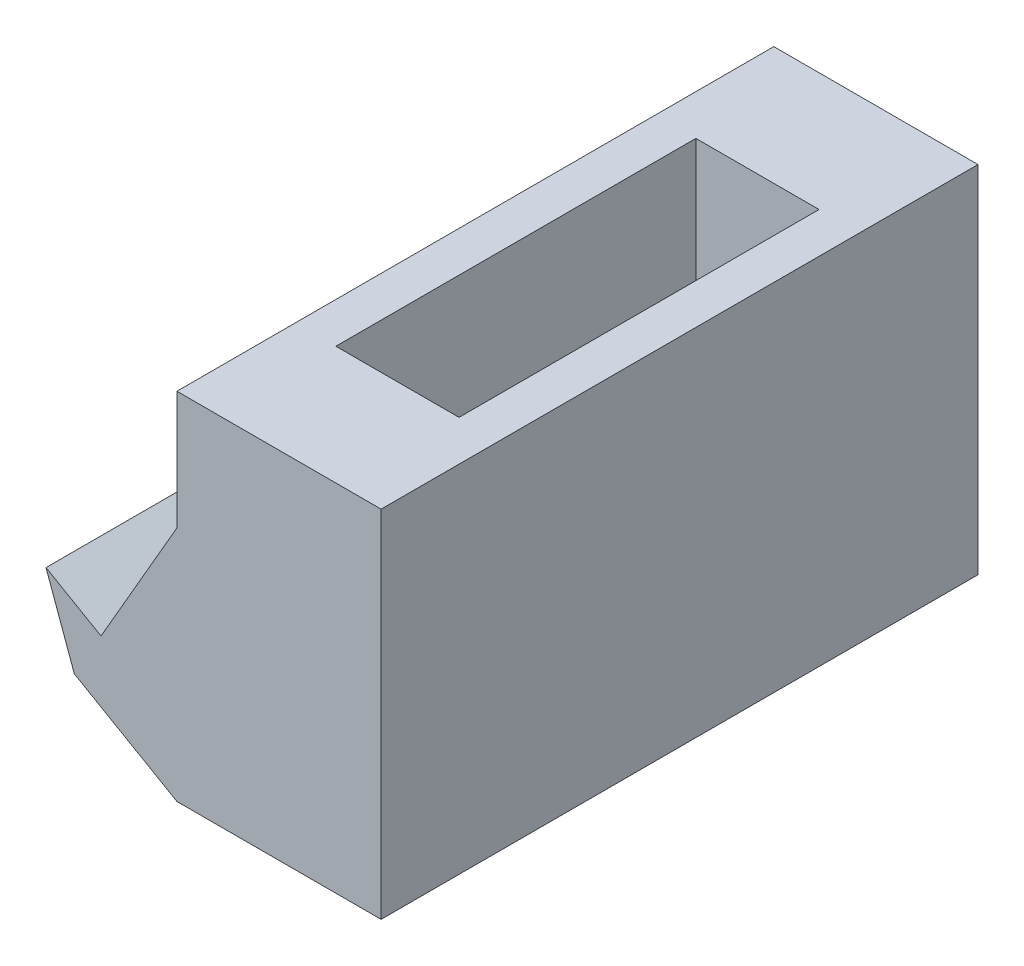
ISO-10303-21;
HEADER;
FILE_DESCRIPTION(('STEP AP214'),'2;1');
FILE_NAME('part.step','',(''),(''),'','','');
FILE_SCHEMA(('AUTOMOTIVE_DESIGN { 1 0 10303 214 1 1 1 1 }'));
ENDSEC;
DATA;
#1=APPLICATION_CONTEXT('core data for automotive mechanical design processes');
#2=APPLICATION_PROTOCOL_DEFINITION('international standard','automotive_design',2000,#1);
#3=PRODUCT_CONTEXT('',#1,'mechanical');
#4=PRODUCT('Part','Part','',(#3));
#5=PRODUCT_RELATED_PRODUCT_CATEGORY('part','',(#4));
#6=PRODUCT_DEFINITION_FORMATION('','',#4);
#7=PRODUCT_DEFINITION_CONTEXT('part definition',#1,'design');
#8=PRODUCT_DEFINITION('design','',#6,#7);
#9=PRODUCT_DEFINITION_SHAPE('','',#8);
#10=(LENGTH_UNIT() NAMED_UNIT(*) SI_UNIT(.MILLI.,.METRE.));
#11=(NAMED_UNIT(*) PLANE_ANGLE_UNIT() SI_UNIT($,.RADIAN.));
#12=(NAMED_UNIT(*) SI_UNIT($,.STERADIAN.) SOLID_ANGLE_UNIT());
#13=UNCERTAINTY_MEASURE_WITH_UNIT(LENGTH_MEASURE(1.E-05),#10,'distance_accuracy_value','');
#14=(GEOMETRIC_REPRESENTATION_CONTEXT(3) GLOBAL_UNCERTAINTY_ASSIGNED_CONTEXT((#13)) GLOBAL_UNIT_ASSIGNED_CONTEXT((#10,
#11,#12)) REPRESENTATION_CONTEXT('',''));
#15=CARTESIAN_POINT('',(0.,0.,0.));
#16=DIRECTION('',(0.,0.,1.));
#17=DIRECTION('',(1.,0.,0.));
#18=AXIS2_PLACEMENT_3D('',#15,#16,#17);
#19=CARTESIAN_POINT('',(-4.31052631578947,-10.,-12.6));
#20=DIRECTION('',(-1.,0.,0.));
#21=DIRECTION('',(0.,0.,1.));
#22=AXIS2_PLACEMENT_3D('',#19,#20,#21);
#23=PLANE('',#22);
#24=DIRECTION('',(0.,1.,0.));
#25=VECTOR('',#24,1.);
#26=CARTESIAN_POINT('',(-4.31052631578947,-10.,-12.6));
#27=LINE('',#26,#25);
#28=CARTESIAN_POINT('',(-4.31052631578947,0.,-12.6));
#29=VERTEX_POINT('',#28);
#30=CARTESIAN_POINT('',(-4.31052631578947,5.,-12.6));
#31=VERTEX_POINT('',#30);
#32=EDGE_CURVE('E248',#29,#31,#27,.T.);
#33=ORIENTED_EDGE('',*,*,#32,.F.);
#34=DIRECTION('',(0.,0.,1.));
#35=VECTOR('',#34,1.);
#36=CARTESIAN_POINT('',(-4.31052631578947,0.,-24.0258440577187));
#37=LINE('',#36,#35);
#38=CARTESIAN_POINT('',(-4.31052631578947,0.,12.6));
#39=VERTEX_POINT('',#38);
#40=EDGE_CURVE('E184',#29,#39,#37,.T.);
#41=ORIENTED_EDGE('',*,*,#40,.T.);
#42=DIRECTION('',(0.,1.,0.));
#43=VECTOR('',#42,1.);
#44=CARTESIAN_POINT('',(-4.31052631578947,-10.,12.6));
#45=LINE('',#44,#43);
#46=CARTESIAN_POINT('',(-4.31052631578947,5.,12.6));
#47=VERTEX_POINT('',#46);
#48=EDGE_CURVE('E78',#39,#47,#45,.T.);
#49=ORIENTED_EDGE('',*,*,#48,.T.);
#50=DIRECTION('',(0.,0.,1.));
#51=VECTOR('',#50,1.);
#52=CARTESIAN_POINT('',(-4.31052631578947,5.,-12.6));
#53=LINE('',#52,#51);
#54=EDGE_CURVE('E215',#31,#47,#53,.T.);
#55=ORIENTED_EDGE('',*,*,#54,.F.);
#56=EDGE_LOOP('',(#33,#41,#49,#55));
#57=FACE_BOUND('',#56,.T.);
#58=ADVANCED_FACE('F69',(#57),#23,.T.);
#59=CARTESIAN_POINT('',(4.31052631578947,-10.,-12.6));
#60=DIRECTION('',(1.,0.,0.));
#61=DIRECTION('',(0.,0.,-1.));
#62=AXIS2_PLACEMENT_3D('',#59,#60,#61);
#63=PLANE('',#62);
#64=DIRECTION('',(0.,1.,0.));
#65=VECTOR('',#64,1.);
#66=CARTESIAN_POINT('',(4.31052631578947,-10.,-12.6));
#67=LINE('',#66,#65);
#68=CARTESIAN_POINT('',(4.31052631578947,-10.,-12.6));
#69=VERTEX_POINT('',#68);
#70=CARTESIAN_POINT('',(4.31052631578947,5.,-12.6));
#71=VERTEX_POINT('',#70);
#72=EDGE_CURVE('E73',#69,#71,#67,.T.);
#73=ORIENTED_EDGE('',*,*,#72,.T.);
#74=DIRECTION('',(0.,0.,-1.));
#75=VECTOR('',#74,1.);
#76=CARTESIAN_POINT('',(4.31052631578947,5.,-12.6));
#77=LINE('',#76,#75);
#78=CARTESIAN_POINT('',(4.31052631578947,5.,12.6));
#79=VERTEX_POINT('',#78);
#80=EDGE_CURVE('E209',#79,#71,#77,.T.);
#81=ORIENTED_EDGE('',*,*,#80,.F.);
#82=DIRECTION('',(0.,1.,0.));
#83=VECTOR('',#82,1.);
#84=CARTESIAN_POINT('',(4.31052631578947,-10.,12.6));
#85=LINE('',#84,#83);
#86=CARTESIAN_POINT('',(4.31052631578947,-10.,12.6));
#87=VERTEX_POINT('',#86);
#88=EDGE_CURVE('E12',#87,#79,#85,.T.);
#89=ORIENTED_EDGE('',*,*,#88,.F.);
#90=DIRECTION('',(0.,0.,-1.));
#91=VECTOR('',#90,1.);
#92=CARTESIAN_POINT('',(4.31052631578947,-10.,-12.6));
#93=LINE('',#92,#91);
#94=EDGE_CURVE('E234',#87,#69,#93,.T.);
#95=ORIENTED_EDGE('',*,*,#94,.T.);
#96=EDGE_LOOP('',(#73,#81,#89,#95));
#97=FACE_BOUND('',#96,.T.);
#98=ADVANCED_FACE('F71',(#97),#63,.T.);
#99=CARTESIAN_POINT('',(-4.31052631578947,-10.,12.6));
#100=DIRECTION('',(0.,0.,1.));
#101=DIRECTION('',(1.,0.,0.));
#102=AXIS2_PLACEMENT_3D('',#99,#100,#101);
#103=PLANE('',#102);
#104=ORIENTED_EDGE('',*,*,#88,.T.);
#105=DIRECTION('',(1.,0.,0.));
#106=VECTOR('',#105,1.);
#107=CARTESIAN_POINT('',(-4.31052631578947,5.,12.6));
#108=LINE('',#107,#106);
#109=EDGE_CURVE('E218',#47,#79,#108,.T.);
#110=ORIENTED_EDGE('',*,*,#109,.F.);
#111=ORIENTED_EDGE('',*,*,#48,.F.);
#112=DIRECTION('',(-0.499999999999998,-0.86602540378444,0.));
#113=VECTOR('',#112,1.);
#114=CARTESIAN_POINT('',(-3.23289473684212,1.86651264657751,12.6));
#115=LINE('',#114,#113);
#116=CARTESIAN_POINT('',(-7.51577501776022,-5.55165360270757,12.6));
#117=VERTEX_POINT('',#116);
#118=EDGE_CURVE('E86',#39,#117,#115,.T.);
#119=ORIENTED_EDGE('',*,*,#118,.T.);
#120=DIRECTION('',(0.866025403784434,-0.500000000000008,0.));
#121=VECTOR('',#120,1.);
#122=CARTESIAN_POINT('',(-4.28288028091821,-7.41816624928506,12.6));
#123=LINE('',#122,#121);
#124=CARTESIAN_POINT('',(-9.83772383635148,-4.21107582724934,12.6));
#125=VERTEX_POINT('',#124);
#126=EDGE_CURVE('E190',#125,#117,#123,.T.);
#127=ORIENTED_EDGE('',*,*,#126,.F.);
#128=DIRECTION('',(-0.342020143325666,0.93969262078591,0.));
#129=VECTOR('',#128,1.);
#130=CARTESIAN_POINT('',(-10.040342439667,-3.65438578987846,12.6));
#131=LINE('',#130,#129);
#132=CARTESIAN_POINT('',(-8.64065333471165,-7.50000000000003,12.6));
#133=VERTEX_POINT('',#132);
#134=EDGE_CURVE('E169',#133,#125,#131,.T.);
#135=ORIENTED_EDGE('',*,*,#134,.F.);
#136=DIRECTION('',(0.86602540378444,-0.499999999999998,0.));
#137=VECTOR('',#136,1.);
#138=CARTESIAN_POINT('',(-5.40775859786954,-9.36651264657753,12.6));
#139=LINE('',#138,#137);
#140=CARTESIAN_POINT('',(-4.31052631578947,-10.,12.6));
#141=VERTEX_POINT('',#140);
#142=EDGE_CURVE('E165',#133,#141,#139,.T.);
#143=ORIENTED_EDGE('',*,*,#142,.T.);
#144=DIRECTION('',(1.,0.,0.));
#145=VECTOR('',#144,1.);
#146=CARTESIAN_POINT('',(-4.31052631578947,-10.,12.6));
#147=LINE('',#146,#145);
#148=EDGE_CURVE('E245',#141,#87,#147,.T.);
#149=ORIENTED_EDGE('',*,*,#148,.T.);
#150=EDGE_LOOP('',(#104,#110,#111,#119,#127,#135,#143,#149));
#151=FACE_BOUND('',#150,.T.);
#152=ADVANCED_FACE('F262',(#151),#103,.T.);
#153=CARTESIAN_POINT('',(-4.31052631578947,-10.,-12.6));
#154=DIRECTION('',(0.,0.,-1.));
#155=DIRECTION('',(-1.,0.,0.));
#156=AXIS2_PLACEMENT_3D('',#153,#154,#155);
#157=PLANE('',#156);
#158=DIRECTION('',(-1.,0.,0.));
#159=VECTOR('',#158,1.);
#160=CARTESIAN_POINT('',(-4.31052631578947,-10.,-12.6));
#161=LINE('',#160,#159);
#162=CARTESIAN_POINT('',(-4.31052631578947,-10.,-12.6));
#163=VERTEX_POINT('',#162);
#164=EDGE_CURVE('E183',#69,#163,#161,.T.);
#165=ORIENTED_EDGE('',*,*,#164,.T.);
#166=DIRECTION('',(0.86602540378444,-0.499999999999998,0.));
#167=VECTOR('',#166,1.);
#168=CARTESIAN_POINT('',(-5.40775859786954,-9.36651264657753,-12.6));
#169=LINE('',#168,#167);
#170=CARTESIAN_POINT('',(-8.64065333471165,-7.50000000000003,-12.6));
#171=VERTEX_POINT('',#170);
#172=EDGE_CURVE('E162',#171,#163,#169,.T.);
#173=ORIENTED_EDGE('',*,*,#172,.F.);
#174=DIRECTION('',(-0.342020143325666,0.93969262078591,0.));
#175=VECTOR('',#174,1.);
#176=CARTESIAN_POINT('',(-10.040342439667,-3.65438578987846,-12.6));
#177=LINE('',#176,#175);
#178=CARTESIAN_POINT('',(-9.83772383635148,-4.21107582724934,-12.6));
#179=VERTEX_POINT('',#178);
#180=EDGE_CURVE('E172',#171,#179,#177,.T.);
#181=ORIENTED_EDGE('',*,*,#180,.T.);
#182=DIRECTION('',(0.866025403784434,-0.500000000000008,0.));
#183=VECTOR('',#182,1.);
#184=CARTESIAN_POINT('',(-4.28288028091821,-7.41816624928506,-12.6));
#185=LINE('',#184,#183);
#186=CARTESIAN_POINT('',(-7.51577501776022,-5.55165360270757,-12.6));
#187=VERTEX_POINT('',#186);
#188=EDGE_CURVE('E178',#179,#187,#185,.T.);
#189=ORIENTED_EDGE('',*,*,#188,.T.);
#190=DIRECTION('',(-0.499999999999998,-0.86602540378444,0.));
#191=VECTOR('',#190,1.);
#192=CARTESIAN_POINT('',(-3.23289473684212,1.86651264657751,-12.6));
#193=LINE('',#192,#191);
#194=EDGE_CURVE('E192',#29,#187,#193,.T.);
#195=ORIENTED_EDGE('',*,*,#194,.F.);
#196=ORIENTED_EDGE('',*,*,#32,.T.);
#197=DIRECTION('',(-1.,0.,0.));
#198=VECTOR('',#197,1.);
#199=CARTESIAN_POINT('',(-4.31052631578947,5.,-12.6));
#200=LINE('',#199,#198);
#201=EDGE_CURVE('E212',#71,#31,#200,.T.);
#202=ORIENTED_EDGE('',*,*,#201,.F.);
#203=ORIENTED_EDGE('',*,*,#72,.F.);
#204=EDGE_LOOP('',(#165,#173,#181,#189,#195,#196,#202,#203));
#205=FACE_BOUND('',#204,.T.);
#206=ADVANCED_FACE('F181',(#205),#157,.T.);
#207=CARTESIAN_POINT('',(0.,-10.,0.));
#208=DIRECTION('',(0.,1.,0.));
#209=DIRECTION('',(0.,0.,1.));
#210=AXIS2_PLACEMENT_3D('',#207,#208,#209);
#211=PLANE('',#210);
#212=DIRECTION('',(1.,0.,0.));
#213=VECTOR('',#212,1.);
#214=CARTESIAN_POINT('',(-2.6,-10.,7.6));
#215=LINE('',#214,#213);
#216=CARTESIAN_POINT('',(-2.6,-10.,7.6));
#217=VERTEX_POINT('',#216);
#218=CARTESIAN_POINT('',(2.6,-10.,7.6));
#219=VERTEX_POINT('',#218);
#220=EDGE_CURVE('E228',#217,#219,#215,.T.);
#221=ORIENTED_EDGE('',*,*,#220,.T.);
#222=DIRECTION('',(0.,0.,-1.));
#223=VECTOR('',#222,1.);
#224=CARTESIAN_POINT('',(2.6,-10.,-7.6));
#225=LINE('',#224,#223);
#226=CARTESIAN_POINT('',(2.6,-10.,-7.6));
#227=VERTEX_POINT('',#226);
#228=EDGE_CURVE('E221',#219,#227,#225,.T.);
#229=ORIENTED_EDGE('',*,*,#228,.T.);
#230=DIRECTION('',(-1.,0.,0.));
#231=VECTOR('',#230,1.);
#232=CARTESIAN_POINT('',(-2.6,-10.,-7.6));
#233=LINE('',#232,#231);
#234=CARTESIAN_POINT('',(-2.6,-10.,-7.6));
#235=VERTEX_POINT('',#234);
#236=EDGE_CURVE('E224',#227,#235,#233,.T.);
#237=ORIENTED_EDGE('',*,*,#236,.T.);
#238=DIRECTION('',(0.,0.,1.));
#239=VECTOR('',#238,1.);
#240=CARTESIAN_POINT('',(-2.6,-10.,-7.6));
#241=LINE('',#240,#239);
#242=EDGE_CURVE('E94',#235,#217,#241,.T.);
#243=ORIENTED_EDGE('',*,*,#242,.T.);
#244=EDGE_LOOP('',(#221,#229,#237,#243));
#245=FACE_BOUND('',#244,.T.);
#246=ORIENTED_EDGE('',*,*,#94,.F.);
#247=ORIENTED_EDGE('',*,*,#148,.F.);
#248=DIRECTION('',(0.,0.,1.));
#249=VECTOR('',#248,1.);
#250=CARTESIAN_POINT('',(-4.31052631578947,-10.,-12.6));
#251=LINE('',#250,#249);
#252=EDGE_CURVE('E243',#163,#141,#251,.T.);
#253=ORIENTED_EDGE('',*,*,#252,.F.);
#254=ORIENTED_EDGE('',*,*,#164,.F.);
#255=EDGE_LOOP('',(#246,#247,#253,#254));
#256=FACE_BOUND('',#255,.T.);
#257=ADVANCED_FACE('F265',(#245,#256),#211,.F.);
#258=CARTESIAN_POINT('',(2.6,-10.,-7.6));
#259=DIRECTION('',(1.,0.,0.));
#260=DIRECTION('',(0.,0.,-1.));
#261=AXIS2_PLACEMENT_3D('',#258,#259,#260);
#262=PLANE('',#261);
#263=DIRECTION('',(0.,1.,0.));
#264=VECTOR('',#263,1.);
#265=CARTESIAN_POINT('',(2.6,-10.,7.6));
#266=LINE('',#265,#264);
#267=CARTESIAN_POINT('',(2.6,5.,7.6));
#268=VERTEX_POINT('',#267);
#269=EDGE_CURVE('E232',#219,#268,#266,.T.);
#270=ORIENTED_EDGE('',*,*,#269,.T.);
#271=DIRECTION('',(0.,0.,-1.));
#272=VECTOR('',#271,1.);
#273=CARTESIAN_POINT('',(2.6,5.,-7.6));
#274=LINE('',#273,#272);
#275=CARTESIAN_POINT('',(2.6,5.,-7.6));
#276=VERTEX_POINT('',#275);
#277=EDGE_CURVE('E194',#268,#276,#274,.T.);
#278=ORIENTED_EDGE('',*,*,#277,.T.);
#279=DIRECTION('',(0.,1.,0.));
#280=VECTOR('',#279,1.);
#281=CARTESIAN_POINT('',(2.6,-10.,-7.6));
#282=LINE('',#281,#280);
#283=EDGE_CURVE('E231',#227,#276,#282,.T.);
#284=ORIENTED_EDGE('',*,*,#283,.F.);
#285=ORIENTED_EDGE('',*,*,#228,.F.);
#286=EDGE_LOOP('',(#270,#278,#284,#285));
#287=FACE_BOUND('',#286,.T.);
#288=ADVANCED_FACE('F294',(#287),#262,.F.);
#289=CARTESIAN_POINT('',(-2.6,-10.,7.6));
#290=DIRECTION('',(0.,0.,1.));
#291=DIRECTION('',(1.,0.,0.));
#292=AXIS2_PLACEMENT_3D('',#289,#290,#291);
#293=PLANE('',#292);
#294=DIRECTION('',(0.,1.,0.));
#295=VECTOR('',#294,1.);
#296=CARTESIAN_POINT('',(-2.6,-10.,7.6));
#297=LINE('',#296,#295);
#298=CARTESIAN_POINT('',(-2.6,5.,7.6));
#299=VERTEX_POINT('',#298);
#300=EDGE_CURVE('E235',#217,#299,#297,.T.);
#301=ORIENTED_EDGE('',*,*,#300,.T.);
#302=DIRECTION('',(1.,0.,0.));
#303=VECTOR('',#302,1.);
#304=CARTESIAN_POINT('',(-2.6,5.,7.6));
#305=LINE('',#304,#303);
#306=EDGE_CURVE('E206',#299,#268,#305,.T.);
#307=ORIENTED_EDGE('',*,*,#306,.T.);
#308=ORIENTED_EDGE('',*,*,#269,.F.);
#309=ORIENTED_EDGE('',*,*,#220,.F.);
#310=EDGE_LOOP('',(#301,#307,#308,#309));
#311=FACE_BOUND('',#310,.T.);
#312=ADVANCED_FACE('F313',(#311),#293,.F.);
#313=CARTESIAN_POINT('',(-2.6,-10.,-7.6));
#314=DIRECTION('',(-1.,0.,0.));
#315=DIRECTION('',(0.,0.,1.));
#316=AXIS2_PLACEMENT_3D('',#313,#314,#315);
#317=PLANE('',#316);
#318=DIRECTION('',(0.,1.,0.));
#319=VECTOR('',#318,1.);
#320=CARTESIAN_POINT('',(-2.6,-10.,-7.6));
#321=LINE('',#320,#319);
#322=CARTESIAN_POINT('',(-2.6,5.,-7.6));
#323=VERTEX_POINT('',#322);
#324=EDGE_CURVE('E237',#235,#323,#321,.T.);
#325=ORIENTED_EDGE('',*,*,#324,.T.);
#326=DIRECTION('',(0.,0.,1.));
#327=VECTOR('',#326,1.);
#328=CARTESIAN_POINT('',(-2.6,5.,-7.6));
#329=LINE('',#328,#327);
#330=EDGE_CURVE('E203',#323,#299,#329,.T.);
#331=ORIENTED_EDGE('',*,*,#330,.T.);
#332=ORIENTED_EDGE('',*,*,#300,.F.);
#333=ORIENTED_EDGE('',*,*,#242,.F.);
#334=EDGE_LOOP('',(#325,#331,#332,#333));
#335=FACE_BOUND('',#334,.T.);
#336=ADVANCED_FACE('F325',(#335),#317,.F.);
#337=CARTESIAN_POINT('',(-2.6,-10.,-7.6));
#338=DIRECTION('',(0.,0.,-1.));
#339=DIRECTION('',(-1.,0.,0.));
#340=AXIS2_PLACEMENT_3D('',#337,#338,#339);
#341=PLANE('',#340);
#342=ORIENTED_EDGE('',*,*,#283,.T.);
#343=DIRECTION('',(-1.,0.,0.));
#344=VECTOR('',#343,1.);
#345=CARTESIAN_POINT('',(-2.6,5.,-7.6));
#346=LINE('',#345,#344);
#347=EDGE_CURVE('E200',#276,#323,#346,.T.);
#348=ORIENTED_EDGE('',*,*,#347,.T.);
#349=ORIENTED_EDGE('',*,*,#324,.F.);
#350=ORIENTED_EDGE('',*,*,#236,.F.);
#351=EDGE_LOOP('',(#342,#348,#349,#350));
#352=FACE_BOUND('',#351,.T.);
#353=ADVANCED_FACE('F336',(#352),#341,.F.);
#354=CARTESIAN_POINT('',(0.,5.,0.));
#355=DIRECTION('',(0.,1.,0.));
#356=DIRECTION('',(0.,0.,1.));
#357=AXIS2_PLACEMENT_3D('',#354,#355,#356);
#358=PLANE('',#357);
#359=ORIENTED_EDGE('',*,*,#80,.T.);
#360=ORIENTED_EDGE('',*,*,#201,.T.);
#361=ORIENTED_EDGE('',*,*,#54,.T.);
#362=ORIENTED_EDGE('',*,*,#109,.T.);
#363=EDGE_LOOP('',(#359,#360,#361,#362));
#364=FACE_BOUND('',#363,.T.);
#365=ORIENTED_EDGE('',*,*,#347,.F.);
#366=ORIENTED_EDGE('',*,*,#277,.F.);
#367=ORIENTED_EDGE('',*,*,#306,.F.);
#368=ORIENTED_EDGE('',*,*,#330,.F.);
#369=EDGE_LOOP('',(#365,#366,#367,#368));
#370=FACE_BOUND('',#369,.T.);
#371=ADVANCED_FACE('F257',(#364,#370),#358,.T.);
#372=CARTESIAN_POINT('',(-4.28288028091821,-7.41816624928506,-24.0258440577187));
#373=DIRECTION('',(-0.500000000000008,-0.866025403784434,0.));
#374=DIRECTION('',(0.866025403784434,-0.500000000000008,0.));
#375=AXIS2_PLACEMENT_3D('',#372,#373,#374);
#376=PLANE('',#375);
#377=ORIENTED_EDGE('',*,*,#188,.F.);
#378=DIRECTION('',(0.,0.,1.));
#379=VECTOR('',#378,1.);
#380=CARTESIAN_POINT('',(-9.83772383635148,-4.21107582724934,-24.0258440577187));
#381=LINE('',#380,#379);
#382=EDGE_CURVE('E174',#179,#125,#381,.T.);
#383=ORIENTED_EDGE('',*,*,#382,.T.);
#384=ORIENTED_EDGE('',*,*,#126,.T.);
#385=DIRECTION('',(0.,0.,1.));
#386=VECTOR('',#385,1.);
#387=CARTESIAN_POINT('',(-7.51577501776022,-5.55165360270757,-24.0258440577187));
#388=LINE('',#387,#386);
#389=EDGE_CURVE('E186',#187,#117,#388,.T.);
#390=ORIENTED_EDGE('',*,*,#389,.F.);
#391=EDGE_LOOP('',(#377,#383,#384,#390));
#392=FACE_BOUND('',#391,.T.);
#393=ADVANCED_FACE('F272',(#392),#376,.F.);
#394=CARTESIAN_POINT('',(-10.040342439667,-3.65438578987846,-24.0258440577187));
#395=DIRECTION('',(0.939692620785909,0.342020143325666,0.));
#396=DIRECTION('',(-0.342020143325666,0.93969262078591,0.));
#397=AXIS2_PLACEMENT_3D('',#394,#395,#396);
#398=PLANE('',#397);
#399=ORIENTED_EDGE('',*,*,#180,.F.);
#400=DIRECTION('',(0.,0.,1.));
#401=VECTOR('',#400,1.);
#402=CARTESIAN_POINT('',(-8.64065333471165,-7.50000000000003,-24.0258440577187));
#403=LINE('',#402,#401);
#404=EDGE_CURVE('E158',#171,#133,#403,.T.);
#405=ORIENTED_EDGE('',*,*,#404,.T.);
#406=ORIENTED_EDGE('',*,*,#134,.T.);
#407=ORIENTED_EDGE('',*,*,#382,.F.);
#408=EDGE_LOOP('',(#399,#405,#406,#407));
#409=FACE_BOUND('',#408,.T.);
#410=ADVANCED_FACE('F173',(#409),#398,.F.);
#411=CARTESIAN_POINT('',(-5.40775859786954,-9.36651264657753,-24.0258440577187));
#412=DIRECTION('',(-0.499999999999998,-0.86602540378444,0.));
#413=DIRECTION('',(0.86602540378444,-0.499999999999998,0.));
#414=AXIS2_PLACEMENT_3D('',#411,#412,#413);
#415=PLANE('',#414);
#416=ORIENTED_EDGE('',*,*,#404,.F.);
#417=ORIENTED_EDGE('',*,*,#172,.T.);
#418=ORIENTED_EDGE('',*,*,#252,.T.);
#419=ORIENTED_EDGE('',*,*,#142,.F.);
#420=EDGE_LOOP('',(#416,#417,#418,#419));
#421=FACE_BOUND('',#420,.T.);
#422=ADVANCED_FACE('F160',(#421),#415,.T.);
#423=CARTESIAN_POINT('',(-3.23289473684212,1.86651264657751,-24.0258440577187));
#424=DIRECTION('',(-0.86602540378444,0.499999999999998,0.));
#425=DIRECTION('',(-0.499999999999998,-0.86602540378444,0.));
#426=AXIS2_PLACEMENT_3D('',#423,#424,#425);
#427=PLANE('',#426);
#428=ORIENTED_EDGE('',*,*,#40,.F.);
#429=ORIENTED_EDGE('',*,*,#194,.T.);
#430=ORIENTED_EDGE('',*,*,#389,.T.);
#431=ORIENTED_EDGE('',*,*,#118,.F.);
#432=EDGE_LOOP('',(#428,#429,#430,#431));
#433=FACE_BOUND('',#432,.T.);
#434=ADVANCED_FACE('F274',(#433),#427,.T.);
#435=CLOSED_SHELL('',(#58,#98,#152,#206,#257,#288,#312,#336,#353,#371,#393,#410,#422,#434));
#436=MANIFOLD_SOLID_BREP('B2',#435);
#437=ADVANCED_BREP_SHAPE_REPRESENTATION('',(#18,#436),#14);
#438=SHAPE_DEFINITION_REPRESENTATION(#9,#437);
ENDSEC;
END-ISO-10303-21;
